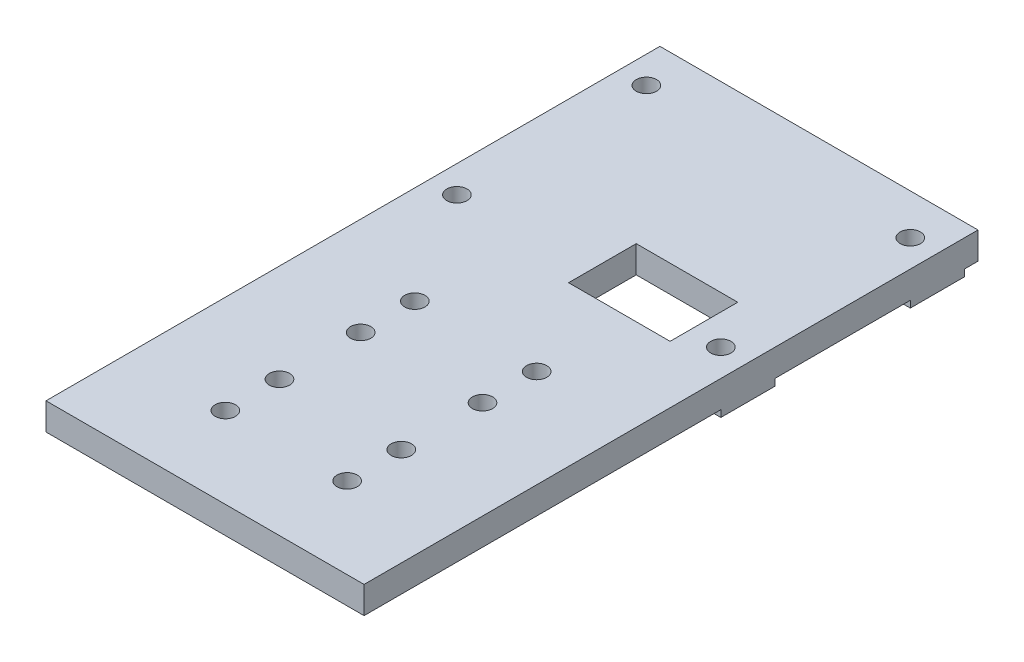
ISO-10303-21;
HEADER;
FILE_DESCRIPTION(('STEP AP214'),'2;1');
FILE_NAME('part.step','',(''),(''),'','','');
FILE_SCHEMA(('AUTOMOTIVE_DESIGN { 1 0 10303 214 1 1 1 1 }'));
ENDSEC;
DATA;
#1=APPLICATION_CONTEXT('core data for automotive mechanical design processes');
#2=APPLICATION_PROTOCOL_DEFINITION('international standard','automotive_design',2000,#1);
#3=PRODUCT_CONTEXT('',#1,'mechanical');
#4=PRODUCT('Part','Part','',(#3));
#5=PRODUCT_RELATED_PRODUCT_CATEGORY('part','',(#4));
#6=PRODUCT_DEFINITION_FORMATION('','',#4);
#7=PRODUCT_DEFINITION_CONTEXT('part definition',#1,'design');
#8=PRODUCT_DEFINITION('design','',#6,#7);
#9=PRODUCT_DEFINITION_SHAPE('','',#8);
#10=(LENGTH_UNIT() NAMED_UNIT(*) SI_UNIT(.MILLI.,.METRE.));
#11=(NAMED_UNIT(*) PLANE_ANGLE_UNIT() SI_UNIT($,.RADIAN.));
#12=(NAMED_UNIT(*) SI_UNIT($,.STERADIAN.) SOLID_ANGLE_UNIT());
#13=UNCERTAINTY_MEASURE_WITH_UNIT(LENGTH_MEASURE(1.E-05),#10,'distance_accuracy_value','');
#14=(GEOMETRIC_REPRESENTATION_CONTEXT(3) GLOBAL_UNCERTAINTY_ASSIGNED_CONTEXT((#13)) GLOBAL_UNIT_ASSIGNED_CONTEXT((#10,
#11,#12)) REPRESENTATION_CONTEXT('',''));
#15=CARTESIAN_POINT('',(0.,0.,0.));
#16=DIRECTION('',(0.,0.,1.));
#17=DIRECTION('',(1.,0.,0.));
#18=AXIS2_PLACEMENT_3D('',#15,#16,#17);
#19=CARTESIAN_POINT('',(0.,0.,0.));
#20=DIRECTION('',(0.,1.,0.));
#21=DIRECTION('',(0.,0.,1.));
#22=AXIS2_PLACEMENT_3D('',#19,#20,#21);
#23=PLANE('',#22);
#24=CARTESIAN_POINT('',(-9.,0.,30.72));
#25=DIRECTION('',(0.,1.,0.));
#26=DIRECTION('',(0.,0.,-1.));
#27=AXIS2_PLACEMENT_3D('',#24,#25,#26);
#28=CIRCLE('',#27,1.5);
#29=CARTESIAN_POINT('',(-9.,0.,29.22));
#30=VERTEX_POINT('',#29);
#31=EDGE_CURVE('E214',#30,#30,#28,.T.);
#32=ORIENTED_EDGE('',*,*,#31,.T.);
#33=EDGE_LOOP('',(#32));
#34=FACE_BOUND('',#33,.T.);
#35=CARTESIAN_POINT('',(-9.,0.,50.72));
#36=DIRECTION('',(0.,1.,0.));
#37=DIRECTION('',(0.,0.,-1.));
#38=AXIS2_PLACEMENT_3D('',#35,#36,#37);
#39=CIRCLE('',#38,1.5);
#40=CARTESIAN_POINT('',(-9.,0.,49.22));
#41=VERTEX_POINT('',#40);
#42=EDGE_CURVE('E502',#41,#41,#39,.T.);
#43=ORIENTED_EDGE('',*,*,#42,.T.);
#44=EDGE_LOOP('',(#43));
#45=FACE_BOUND('',#44,.T.);
#46=CARTESIAN_POINT('',(9.00000000000001,0.,50.72));
#47=DIRECTION('',(0.,1.,0.));
#48=DIRECTION('',(0.,0.,1.));
#49=AXIS2_PLACEMENT_3D('',#46,#47,#48);
#50=CIRCLE('',#49,1.5);
#51=CARTESIAN_POINT('',(9.00000000000001,0.,52.22));
#52=VERTEX_POINT('',#51);
#53=EDGE_CURVE('E494',#52,#52,#50,.T.);
#54=ORIENTED_EDGE('',*,*,#53,.T.);
#55=EDGE_LOOP('',(#54));
#56=FACE_BOUND('',#55,.T.);
#57=CARTESIAN_POINT('',(9.00000000000001,0.,38.72));
#58=DIRECTION('',(0.,1.,0.));
#59=DIRECTION('',(0.,0.,1.));
#60=AXIS2_PLACEMENT_3D('',#57,#58,#59);
#61=CIRCLE('',#60,1.5);
#62=CARTESIAN_POINT('',(9.00000000000001,0.,40.22));
#63=VERTEX_POINT('',#62);
#64=EDGE_CURVE('E1096',#63,#63,#61,.T.);
#65=ORIENTED_EDGE('',*,*,#64,.T.);
#66=EDGE_LOOP('',(#65));
#67=FACE_BOUND('',#66,.T.);
#68=CARTESIAN_POINT('',(9.00000000000002,0.,58.72));
#69=DIRECTION('',(0.,1.,0.));
#70=DIRECTION('',(0.,0.,1.));
#71=AXIS2_PLACEMENT_3D('',#68,#69,#70);
#72=CIRCLE('',#71,1.5);
#73=CARTESIAN_POINT('',(9.00000000000002,0.,60.22));
#74=VERTEX_POINT('',#73);
#75=EDGE_CURVE('E1088',#74,#74,#72,.T.);
#76=ORIENTED_EDGE('',*,*,#75,.T.);
#77=EDGE_LOOP('',(#76));
#78=FACE_BOUND('',#77,.T.);
#79=CARTESIAN_POINT('',(-9.,0.,58.72));
#80=DIRECTION('',(0.,1.,0.));
#81=DIRECTION('',(0.,0.,-1.));
#82=AXIS2_PLACEMENT_3D('',#79,#80,#81);
#83=CIRCLE('',#82,1.5);
#84=CARTESIAN_POINT('',(-9.,0.,57.22));
#85=VERTEX_POINT('',#84);
#86=EDGE_CURVE('E1080',#85,#85,#83,.T.);
#87=ORIENTED_EDGE('',*,*,#86,.T.);
#88=EDGE_LOOP('',(#87));
#89=FACE_BOUND('',#88,.T.);
#90=CARTESIAN_POINT('',(-9.,0.,38.72));
#91=DIRECTION('',(0.,1.,0.));
#92=DIRECTION('',(0.,0.,-1.));
#93=AXIS2_PLACEMENT_3D('',#90,#91,#92);
#94=CIRCLE('',#93,1.5);
#95=CARTESIAN_POINT('',(-9.,0.,37.22));
#96=VERTEX_POINT('',#95);
#97=EDGE_CURVE('E1072',#96,#96,#94,.T.);
#98=ORIENTED_EDGE('',*,*,#97,.T.);
#99=EDGE_LOOP('',(#98));
#100=FACE_BOUND('',#99,.T.);
#101=CARTESIAN_POINT('',(9.00000000000001,0.,30.72));
#102=DIRECTION('',(0.,1.,0.));
#103=DIRECTION('',(0.,0.,1.));
#104=AXIS2_PLACEMENT_3D('',#101,#102,#103);
#105=CIRCLE('',#104,1.5);
#106=CARTESIAN_POINT('',(9.00000000000001,0.,32.22));
#107=VERTEX_POINT('',#106);
#108=EDGE_CURVE('E507',#107,#107,#105,.T.);
#109=ORIENTED_EDGE('',*,*,#108,.T.);
#110=EDGE_LOOP('',(#109));
#111=FACE_BOUND('',#110,.T.);
#112=DIRECTION('',(0.,0.,1.));
#113=VECTOR('',#112,1.);
#114=CARTESIAN_POINT('',(0.,0.,0.));
#115=LINE('',#114,#113);
#116=CARTESIAN_POINT('',(0.,0.,7.));
#117=VERTEX_POINT('',#116);
#118=CARTESIAN_POINT('',(0.,0.,17.));
#119=VERTEX_POINT('',#118);
#120=EDGE_CURVE('E256',#117,#119,#115,.T.);
#121=ORIENTED_EDGE('',*,*,#120,.T.);
#122=DIRECTION('',(-1.,0.,0.));
#123=VECTOR('',#122,1.);
#124=CARTESIAN_POINT('',(0.,0.,17.));
#125=LINE('',#124,#123);
#126=CARTESIAN_POINT('',(15.,0.,17.));
#127=VERTEX_POINT('',#126);
#128=EDGE_CURVE('E267',#127,#119,#125,.T.);
#129=ORIENTED_EDGE('',*,*,#128,.F.);
#130=DIRECTION('',(0.,0.,1.));
#131=VECTOR('',#130,1.);
#132=CARTESIAN_POINT('',(15.,0.,0.));
#133=LINE('',#132,#131);
#134=CARTESIAN_POINT('',(15.,0.,6.99999999999999));
#135=VERTEX_POINT('',#134);
#136=EDGE_CURVE('E264',#135,#127,#133,.T.);
#137=ORIENTED_EDGE('',*,*,#136,.F.);
#138=DIRECTION('',(1.,0.,0.));
#139=VECTOR('',#138,1.);
#140=CARTESIAN_POINT('',(0.,0.,7.));
#141=LINE('',#140,#139);
#142=EDGE_CURVE('E260',#117,#135,#141,.T.);
#143=ORIENTED_EDGE('',*,*,#142,.F.);
#144=EDGE_LOOP('',(#121,#129,#137,#143));
#145=FACE_BOUND('',#144,.T.);
#146=DIRECTION('',(0.,0.,-1.));
#147=VECTOR('',#146,1.);
#148=CARTESIAN_POINT('',(23.5,0.,0.));
#149=LINE('',#148,#147);
#150=CARTESIAN_POINT('',(23.5,0.,70.72));
#151=VERTEX_POINT('',#150);
#152=CARTESIAN_POINT('',(23.5,0.,18.));
#153=VERTEX_POINT('',#152);
#154=EDGE_CURVE('E276',#151,#153,#149,.T.);
#155=ORIENTED_EDGE('',*,*,#154,.F.);
#156=DIRECTION('',(-1.,0.,0.));
#157=VECTOR('',#156,1.);
#158=CARTESIAN_POINT('',(-23.5,0.,70.72));
#159=LINE('',#158,#157);
#160=CARTESIAN_POINT('',(-23.5,0.,70.72));
#161=VERTEX_POINT('',#160);
#162=EDGE_CURVE('E215',#151,#161,#159,.T.);
#163=ORIENTED_EDGE('',*,*,#162,.T.);
#164=DIRECTION('',(0.,0.,-1.));
#165=VECTOR('',#164,1.);
#166=CARTESIAN_POINT('',(-23.5,0.,0.));
#167=LINE('',#166,#165);
#168=CARTESIAN_POINT('',(-23.5,0.,18.));
#169=VERTEX_POINT('',#168);
#170=EDGE_CURVE('E224',#161,#169,#167,.T.);
#171=ORIENTED_EDGE('',*,*,#170,.T.);
#172=DIRECTION('',(-1.,0.,0.));
#173=VECTOR('',#172,1.);
#174=CARTESIAN_POINT('',(-15.5,0.,18.));
#175=LINE('',#174,#173);
#176=CARTESIAN_POINT('',(-15.5,0.,18.));
#177=VERTEX_POINT('',#176);
#178=EDGE_CURVE('E70',#177,#169,#175,.T.);
#179=ORIENTED_EDGE('',*,*,#178,.F.);
#180=DIRECTION('',(0.,0.,1.));
#181=VECTOR('',#180,1.);
#182=CARTESIAN_POINT('',(-15.5,0.,10.));
#183=LINE('',#182,#181);
#184=CARTESIAN_POINT('',(-15.5,0.,10.));
#185=VERTEX_POINT('',#184);
#186=EDGE_CURVE('E536',#185,#177,#183,.T.);
#187=ORIENTED_EDGE('',*,*,#186,.F.);
#188=DIRECTION('',(1.,0.,0.));
#189=VECTOR('',#188,1.);
#190=CARTESIAN_POINT('',(-15.5,0.,10.));
#191=LINE('',#190,#189);
#192=CARTESIAN_POINT('',(-23.5,0.,10.));
#193=VERTEX_POINT('',#192);
#194=EDGE_CURVE('E529',#193,#185,#191,.T.);
#195=ORIENTED_EDGE('',*,*,#194,.F.);
#196=CARTESIAN_POINT('',(-23.5,0.,-10.));
#197=VERTEX_POINT('',#196);
#198=EDGE_CURVE('E275',#193,#197,#167,.T.);
#199=ORIENTED_EDGE('',*,*,#198,.T.);
#200=DIRECTION('',(-1.,0.,0.));
#201=VECTOR('',#200,1.);
#202=CARTESIAN_POINT('',(-15.5,0.,-10.));
#203=LINE('',#202,#201);
#204=CARTESIAN_POINT('',(-15.5,0.,-10.));
#205=VERTEX_POINT('',#204);
#206=EDGE_CURVE('E459',#205,#197,#203,.T.);
#207=ORIENTED_EDGE('',*,*,#206,.F.);
#208=DIRECTION('',(0.,0.,1.));
#209=VECTOR('',#208,1.);
#210=CARTESIAN_POINT('',(-15.5,0.,-10.));
#211=LINE('',#210,#209);
#212=CARTESIAN_POINT('',(-15.5,0.,-18.));
#213=VERTEX_POINT('',#212);
#214=EDGE_CURVE('E571',#213,#205,#211,.T.);
#215=ORIENTED_EDGE('',*,*,#214,.F.);
#216=DIRECTION('',(1.,0.,0.));
#217=VECTOR('',#216,1.);
#218=CARTESIAN_POINT('',(-15.5,0.,-18.));
#219=LINE('',#218,#217);
#220=CARTESIAN_POINT('',(-23.5,0.,-18.));
#221=VERTEX_POINT('',#220);
#222=EDGE_CURVE('E401',#221,#213,#219,.T.);
#223=ORIENTED_EDGE('',*,*,#222,.F.);
#224=CARTESIAN_POINT('',(-23.5,0.,-20.));
#225=VERTEX_POINT('',#224);
#226=EDGE_CURVE('E271',#221,#225,#167,.T.);
#227=ORIENTED_EDGE('',*,*,#226,.T.);
#228=DIRECTION('',(1.,0.,0.));
#229=VECTOR('',#228,1.);
#230=CARTESIAN_POINT('',(0.,0.,-20.));
#231=LINE('',#230,#229);
#232=CARTESIAN_POINT('',(23.5,0.,-20.));
#233=VERTEX_POINT('',#232);
#234=EDGE_CURVE('E279',#225,#233,#231,.T.);
#235=ORIENTED_EDGE('',*,*,#234,.T.);
#236=CARTESIAN_POINT('',(23.5,0.,-18.));
#237=VERTEX_POINT('',#236);
#238=EDGE_CURVE('E274',#237,#233,#149,.T.);
#239=ORIENTED_EDGE('',*,*,#238,.F.);
#240=DIRECTION('',(1.,0.,0.));
#241=VECTOR('',#240,1.);
#242=CARTESIAN_POINT('',(15.5,0.,-18.));
#243=LINE('',#242,#241);
#244=CARTESIAN_POINT('',(15.5,0.,-18.));
#245=VERTEX_POINT('',#244);
#246=EDGE_CURVE('E415',#245,#237,#243,.T.);
#247=ORIENTED_EDGE('',*,*,#246,.F.);
#248=DIRECTION('',(0.,0.,-1.));
#249=VECTOR('',#248,1.);
#250=CARTESIAN_POINT('',(15.5,0.,-10.));
#251=LINE('',#250,#249);
#252=CARTESIAN_POINT('',(15.5,0.,-10.));
#253=VERTEX_POINT('',#252);
#254=EDGE_CURVE('E352',#253,#245,#251,.T.);
#255=ORIENTED_EDGE('',*,*,#254,.F.);
#256=DIRECTION('',(-1.,0.,0.));
#257=VECTOR('',#256,1.);
#258=CARTESIAN_POINT('',(15.5,0.,-10.));
#259=LINE('',#258,#257);
#260=CARTESIAN_POINT('',(23.5,0.,-10.));
#261=VERTEX_POINT('',#260);
#262=EDGE_CURVE('E420',#261,#253,#259,.T.);
#263=ORIENTED_EDGE('',*,*,#262,.F.);
#264=CARTESIAN_POINT('',(23.5,0.,10.));
#265=VERTEX_POINT('',#264);
#266=EDGE_CURVE('E280',#265,#261,#149,.T.);
#267=ORIENTED_EDGE('',*,*,#266,.F.);
#268=DIRECTION('',(1.,0.,0.));
#269=VECTOR('',#268,1.);
#270=CARTESIAN_POINT('',(15.5,0.,10.));
#271=LINE('',#270,#269);
#272=CARTESIAN_POINT('',(15.5,0.,10.));
#273=VERTEX_POINT('',#272);
#274=EDGE_CURVE('E361',#273,#265,#271,.T.);
#275=ORIENTED_EDGE('',*,*,#274,.F.);
#276=DIRECTION('',(0.,0.,-1.));
#277=VECTOR('',#276,1.);
#278=CARTESIAN_POINT('',(15.5,0.,10.));
#279=LINE('',#278,#277);
#280=CARTESIAN_POINT('',(15.5,0.,18.));
#281=VERTEX_POINT('',#280);
#282=EDGE_CURVE('E349',#281,#273,#279,.T.);
#283=ORIENTED_EDGE('',*,*,#282,.F.);
#284=DIRECTION('',(-1.,0.,0.));
#285=VECTOR('',#284,1.);
#286=CARTESIAN_POINT('',(15.5,0.,18.));
#287=LINE('',#286,#285);
#288=EDGE_CURVE('E343',#153,#281,#287,.T.);
#289=ORIENTED_EDGE('',*,*,#288,.F.);
#290=EDGE_LOOP('',(#155,#163,#171,#179,#187,#195,#199,#207,#215,#223,#227,#235,#239,#247,#255,
#263,#267,#275,#283,#289));
#291=FACE_BOUND('',#290,.T.);
#292=ADVANCED_FACE('F44',(#34,#45,#56,#67,#78,#89,#100,#111,#145,#291),#23,.F.);
#293=CARTESIAN_POINT('',(-23.5,4.,0.));
#294=DIRECTION('',(-1.,0.,0.));
#295=DIRECTION('',(0.,0.,1.));
#296=AXIS2_PLACEMENT_3D('',#293,#294,#295);
#297=PLANE('',#296);
#298=DIRECTION('',(0.,1.,0.));
#299=VECTOR('',#298,1.);
#300=CARTESIAN_POINT('',(-23.5,0.,70.72));
#301=LINE('',#300,#299);
#302=CARTESIAN_POINT('',(-23.5,4.,70.72));
#303=VERTEX_POINT('',#302);
#304=EDGE_CURVE('E208',#161,#303,#301,.T.);
#305=ORIENTED_EDGE('',*,*,#304,.T.);
#306=DIRECTION('',(0.,0.,-1.));
#307=VECTOR('',#306,1.);
#308=CARTESIAN_POINT('',(-23.5,4.,0.));
#309=LINE('',#308,#307);
#310=CARTESIAN_POINT('',(-23.5,4.,-20.));
#311=VERTEX_POINT('',#310);
#312=EDGE_CURVE('E221',#303,#311,#309,.T.);
#313=ORIENTED_EDGE('',*,*,#312,.T.);
#314=DIRECTION('',(0.,-1.,0.));
#315=VECTOR('',#314,1.);
#316=CARTESIAN_POINT('',(-23.5,4.,-20.));
#317=LINE('',#316,#315);
#318=EDGE_CURVE('E54',#311,#225,#317,.T.);
#319=ORIENTED_EDGE('',*,*,#318,.T.);
#320=ORIENTED_EDGE('',*,*,#226,.F.);
#321=DIRECTION('',(0.,1.,0.));
#322=VECTOR('',#321,1.);
#323=CARTESIAN_POINT('',(-23.5,-1.,-18.));
#324=LINE('',#323,#322);
#325=CARTESIAN_POINT('',(-23.5,-1.,-18.));
#326=VERTEX_POINT('',#325);
#327=EDGE_CURVE('E559',#326,#221,#324,.T.);
#328=ORIENTED_EDGE('',*,*,#327,.F.);
#329=DIRECTION('',(0.,0.,-1.));
#330=VECTOR('',#329,1.);
#331=CARTESIAN_POINT('',(-23.5,-1.,-10.));
#332=LINE('',#331,#330);
#333=CARTESIAN_POINT('',(-23.5,-1.,-10.));
#334=VERTEX_POINT('',#333);
#335=EDGE_CURVE('E586',#334,#326,#332,.T.);
#336=ORIENTED_EDGE('',*,*,#335,.F.);
#337=DIRECTION('',(0.,1.,0.));
#338=VECTOR('',#337,1.);
#339=CARTESIAN_POINT('',(-23.5,-1.,-10.));
#340=LINE('',#339,#338);
#341=EDGE_CURVE('E555',#334,#197,#340,.T.);
#342=ORIENTED_EDGE('',*,*,#341,.T.);
#343=ORIENTED_EDGE('',*,*,#198,.F.);
#344=DIRECTION('',(0.,1.,0.));
#345=VECTOR('',#344,1.);
#346=CARTESIAN_POINT('',(-23.5,-1.,10.));
#347=LINE('',#346,#345);
#348=CARTESIAN_POINT('',(-23.5,-1.,10.));
#349=VERTEX_POINT('',#348);
#350=EDGE_CURVE('E520',#349,#193,#347,.T.);
#351=ORIENTED_EDGE('',*,*,#350,.F.);
#352=DIRECTION('',(0.,0.,-1.));
#353=VECTOR('',#352,1.);
#354=CARTESIAN_POINT('',(-23.5,-1.,10.));
#355=LINE('',#354,#353);
#356=CARTESIAN_POINT('',(-23.5,-1.,18.));
#357=VERTEX_POINT('',#356);
#358=EDGE_CURVE('E543',#357,#349,#355,.T.);
#359=ORIENTED_EDGE('',*,*,#358,.F.);
#360=DIRECTION('',(0.,1.,0.));
#361=VECTOR('',#360,1.);
#362=CARTESIAN_POINT('',(-23.5,-1.,18.));
#363=LINE('',#362,#361);
#364=EDGE_CURVE('E517',#357,#169,#363,.T.);
#365=ORIENTED_EDGE('',*,*,#364,.T.);
#366=ORIENTED_EDGE('',*,*,#170,.F.);
#367=EDGE_LOOP('',(#305,#313,#319,#320,#328,#336,#342,#343,#351,#359,#365,#366));
#368=FACE_BOUND('',#367,.T.);
#369=ADVANCED_FACE('F219',(#368),#297,.T.);
#370=CARTESIAN_POINT('',(23.5,4.,0.));
#371=DIRECTION('',(-1.,0.,0.));
#372=DIRECTION('',(0.,0.,1.));
#373=AXIS2_PLACEMENT_3D('',#370,#371,#372);
#374=PLANE('',#373);
#375=DIRECTION('',(0.,0.,-1.));
#376=VECTOR('',#375,1.);
#377=CARTESIAN_POINT('',(23.5,4.,0.));
#378=LINE('',#377,#376);
#379=CARTESIAN_POINT('',(23.5,4.,70.72));
#380=VERTEX_POINT('',#379);
#381=CARTESIAN_POINT('',(23.5,4.,-20.));
#382=VERTEX_POINT('',#381);
#383=EDGE_CURVE('E234',#380,#382,#378,.T.);
#384=ORIENTED_EDGE('',*,*,#383,.F.);
#385=DIRECTION('',(0.,1.,0.));
#386=VECTOR('',#385,1.);
#387=CARTESIAN_POINT('',(23.5,0.,70.72));
#388=LINE('',#387,#386);
#389=EDGE_CURVE('E62',#151,#380,#388,.T.);
#390=ORIENTED_EDGE('',*,*,#389,.F.);
#391=ORIENTED_EDGE('',*,*,#154,.T.);
#392=DIRECTION('',(0.,1.,0.));
#393=VECTOR('',#392,1.);
#394=CARTESIAN_POINT('',(23.5,-1.,18.));
#395=LINE('',#394,#393);
#396=CARTESIAN_POINT('',(23.5,-1.,18.));
#397=VERTEX_POINT('',#396);
#398=EDGE_CURVE('E261',#397,#153,#395,.T.);
#399=ORIENTED_EDGE('',*,*,#398,.F.);
#400=DIRECTION('',(0.,0.,1.));
#401=VECTOR('',#400,1.);
#402=CARTESIAN_POINT('',(23.5,-1.,10.));
#403=LINE('',#402,#401);
#404=CARTESIAN_POINT('',(23.5,-1.,10.));
#405=VERTEX_POINT('',#404);
#406=EDGE_CURVE('E356',#405,#397,#403,.T.);
#407=ORIENTED_EDGE('',*,*,#406,.F.);
#408=DIRECTION('',(0.,1.,0.));
#409=VECTOR('',#408,1.);
#410=CARTESIAN_POINT('',(23.5,-1.,10.));
#411=LINE('',#410,#409);
#412=EDGE_CURVE('E369',#405,#265,#411,.T.);
#413=ORIENTED_EDGE('',*,*,#412,.T.);
#414=ORIENTED_EDGE('',*,*,#266,.T.);
#415=DIRECTION('',(0.,1.,0.));
#416=VECTOR('',#415,1.);
#417=CARTESIAN_POINT('',(23.5,-1.,-10.));
#418=LINE('',#417,#416);
#419=CARTESIAN_POINT('',(23.5,-1.,-10.));
#420=VERTEX_POINT('',#419);
#421=EDGE_CURVE('E456',#420,#261,#418,.T.);
#422=ORIENTED_EDGE('',*,*,#421,.F.);
#423=DIRECTION('',(0.,0.,1.));
#424=VECTOR('',#423,1.);
#425=CARTESIAN_POINT('',(23.5,-1.,-10.));
#426=LINE('',#425,#424);
#427=CARTESIAN_POINT('',(23.5,-1.,-18.));
#428=VERTEX_POINT('',#427);
#429=EDGE_CURVE('E432',#428,#420,#426,.T.);
#430=ORIENTED_EDGE('',*,*,#429,.F.);
#431=DIRECTION('',(0.,1.,0.));
#432=VECTOR('',#431,1.);
#433=CARTESIAN_POINT('',(23.5,-1.,-18.));
#434=LINE('',#433,#432);
#435=EDGE_CURVE('E411',#428,#237,#434,.T.);
#436=ORIENTED_EDGE('',*,*,#435,.T.);
#437=ORIENTED_EDGE('',*,*,#238,.T.);
#438=DIRECTION('',(0.,-1.,0.));
#439=VECTOR('',#438,1.);
#440=CARTESIAN_POINT('',(23.5,4.,-20.));
#441=LINE('',#440,#439);
#442=EDGE_CURVE('E11',#382,#233,#441,.T.);
#443=ORIENTED_EDGE('',*,*,#442,.F.);
#444=EDGE_LOOP('',(#384,#390,#391,#399,#407,#413,#414,#422,#430,#436,#437,#443));
#445=FACE_BOUND('',#444,.T.);
#446=ADVANCED_FACE('F408',(#445),#374,.F.);
#447=CARTESIAN_POINT('',(0.,4.,0.));
#448=DIRECTION('',(1.,0.,0.));
#449=DIRECTION('',(0.,0.,-1.));
#450=AXIS2_PLACEMENT_3D('',#447,#448,#449);
#451=PLANE('',#450);
#452=ORIENTED_EDGE('',*,*,#120,.F.);
#453=DIRECTION('',(0.,-1.,0.));
#454=VECTOR('',#453,1.);
#455=CARTESIAN_POINT('',(0.,4.,7.));
#456=LINE('',#455,#454);
#457=CARTESIAN_POINT('',(0.,4.,7.));
#458=VERTEX_POINT('',#457);
#459=EDGE_CURVE('E48',#458,#117,#456,.T.);
#460=ORIENTED_EDGE('',*,*,#459,.F.);
#461=DIRECTION('',(0.,0.,1.));
#462=VECTOR('',#461,1.);
#463=CARTESIAN_POINT('',(0.,4.,0.));
#464=LINE('',#463,#462);
#465=CARTESIAN_POINT('',(0.,4.,17.));
#466=VERTEX_POINT('',#465);
#467=EDGE_CURVE('E284',#458,#466,#464,.T.);
#468=ORIENTED_EDGE('',*,*,#467,.T.);
#469=DIRECTION('',(0.,-1.,0.));
#470=VECTOR('',#469,1.);
#471=CARTESIAN_POINT('',(0.,4.,17.));
#472=LINE('',#471,#470);
#473=EDGE_CURVE('E255',#466,#119,#472,.T.);
#474=ORIENTED_EDGE('',*,*,#473,.T.);
#475=EDGE_LOOP('',(#452,#460,#468,#474));
#476=FACE_BOUND('',#475,.T.);
#477=ADVANCED_FACE('F46',(#476),#451,.T.);
#478=CARTESIAN_POINT('',(0.,4.,7.));
#479=DIRECTION('',(0.,0.,-1.));
#480=DIRECTION('',(-1.,0.,0.));
#481=AXIS2_PLACEMENT_3D('',#478,#479,#480);
#482=PLANE('',#481);
#483=ORIENTED_EDGE('',*,*,#142,.T.);
#484=DIRECTION('',(0.,-1.,0.));
#485=VECTOR('',#484,1.);
#486=CARTESIAN_POINT('',(15.,4.,6.99999999999999));
#487=LINE('',#486,#485);
#488=CARTESIAN_POINT('',(15.,4.,6.99999999999999));
#489=VERTEX_POINT('',#488);
#490=EDGE_CURVE('E292',#489,#135,#487,.T.);
#491=ORIENTED_EDGE('',*,*,#490,.F.);
#492=DIRECTION('',(1.,0.,0.));
#493=VECTOR('',#492,1.);
#494=CARTESIAN_POINT('',(0.,4.,7.));
#495=LINE('',#494,#493);
#496=EDGE_CURVE('E304',#458,#489,#495,.T.);
#497=ORIENTED_EDGE('',*,*,#496,.F.);
#498=ORIENTED_EDGE('',*,*,#459,.T.);
#499=EDGE_LOOP('',(#483,#491,#497,#498));
#500=FACE_BOUND('',#499,.T.);
#501=ADVANCED_FACE('F303',(#500),#482,.F.);
#502=CARTESIAN_POINT('',(15.,4.,0.));
#503=DIRECTION('',(1.,0.,0.));
#504=DIRECTION('',(0.,0.,-1.));
#505=AXIS2_PLACEMENT_3D('',#502,#503,#504);
#506=PLANE('',#505);
#507=ORIENTED_EDGE('',*,*,#136,.T.);
#508=DIRECTION('',(0.,-1.,0.));
#509=VECTOR('',#508,1.);
#510=CARTESIAN_POINT('',(15.,4.,17.));
#511=LINE('',#510,#509);
#512=CARTESIAN_POINT('',(15.,4.,17.));
#513=VERTEX_POINT('',#512);
#514=EDGE_CURVE('E289',#513,#127,#511,.T.);
#515=ORIENTED_EDGE('',*,*,#514,.F.);
#516=DIRECTION('',(0.,0.,1.));
#517=VECTOR('',#516,1.);
#518=CARTESIAN_POINT('',(15.,4.,0.));
#519=LINE('',#518,#517);
#520=EDGE_CURVE('E318',#489,#513,#519,.T.);
#521=ORIENTED_EDGE('',*,*,#520,.F.);
#522=ORIENTED_EDGE('',*,*,#490,.T.);
#523=EDGE_LOOP('',(#507,#515,#521,#522));
#524=FACE_BOUND('',#523,.T.);
#525=ADVANCED_FACE('F317',(#524),#506,.F.);
#526=CARTESIAN_POINT('',(-19.5,4.,14.));
#527=DIRECTION('',(0.,-1.,0.));
#528=DIRECTION('',(0.,0.,-1.));
#529=AXIS2_PLACEMENT_3D('',#526,#527,#528);
#530=CYLINDRICAL_SURFACE('',#529,1.5);
#531=CARTESIAN_POINT('',(-19.5,4.,14.));
#532=DIRECTION('',(0.,1.,0.));
#533=DIRECTION('',(0.,0.,1.));
#534=AXIS2_PLACEMENT_3D('',#531,#532,#533);
#535=CIRCLE('',#534,1.5);
#536=CARTESIAN_POINT('',(-19.5,4.,15.5));
#537=VERTEX_POINT('',#536);
#538=EDGE_CURVE('E247',#537,#537,#535,.T.);
#539=ORIENTED_EDGE('',*,*,#538,.T.);
#540=EDGE_LOOP('',(#539));
#541=FACE_BOUND('',#540,.T.);
#542=CARTESIAN_POINT('',(-19.5,-1.,14.));
#543=DIRECTION('',(0.,-1.,0.));
#544=DIRECTION('',(0.,0.,-1.));
#545=AXIS2_PLACEMENT_3D('',#542,#543,#544);
#546=CIRCLE('',#545,1.5);
#547=CARTESIAN_POINT('',(-19.5,-1.,12.5));
#548=VERTEX_POINT('',#547);
#549=EDGE_CURVE('E540',#548,#548,#546,.T.);
#550=ORIENTED_EDGE('',*,*,#549,.T.);
#551=EDGE_LOOP('',(#550));
#552=FACE_BOUND('',#551,.T.);
#553=ADVANCED_FACE('F647',(#541,#552),#530,.F.);
#554=CARTESIAN_POINT('',(0.,4.,-20.));
#555=DIRECTION('',(0.,0.,-1.));
#556=DIRECTION('',(-1.,0.,0.));
#557=AXIS2_PLACEMENT_3D('',#554,#555,#556);
#558=PLANE('',#557);
#559=ORIENTED_EDGE('',*,*,#234,.F.);
#560=ORIENTED_EDGE('',*,*,#318,.F.);
#561=DIRECTION('',(1.,0.,0.));
#562=VECTOR('',#561,1.);
#563=CARTESIAN_POINT('',(0.,4.,-20.));
#564=LINE('',#563,#562);
#565=EDGE_CURVE('E232',#311,#382,#564,.T.);
#566=ORIENTED_EDGE('',*,*,#565,.T.);
#567=ORIENTED_EDGE('',*,*,#442,.T.);
#568=EDGE_LOOP('',(#559,#560,#566,#567));
#569=FACE_BOUND('',#568,.T.);
#570=ADVANCED_FACE('F405',(#569),#558,.T.);
#571=CARTESIAN_POINT('',(19.5,4.,-14.));
#572=DIRECTION('',(0.,-1.,0.));
#573=DIRECTION('',(0.,0.,-1.));
#574=AXIS2_PLACEMENT_3D('',#571,#572,#573);
#575=CYLINDRICAL_SURFACE('',#574,1.5);
#576=CARTESIAN_POINT('',(19.5,4.,-14.));
#577=DIRECTION('',(0.,1.,0.));
#578=DIRECTION('',(0.,0.,1.));
#579=AXIS2_PLACEMENT_3D('',#576,#577,#578);
#580=CIRCLE('',#579,1.5);
#581=CARTESIAN_POINT('',(19.5,4.,-12.5));
#582=VERTEX_POINT('',#581);
#583=EDGE_CURVE('E235',#582,#582,#580,.T.);
#584=ORIENTED_EDGE('',*,*,#583,.T.);
#585=EDGE_LOOP('',(#584));
#586=FACE_BOUND('',#585,.T.);
#587=CARTESIAN_POINT('',(19.5,-1.,-14.));
#588=DIRECTION('',(0.,-1.,0.));
#589=DIRECTION('',(0.,0.,-1.));
#590=AXIS2_PLACEMENT_3D('',#587,#588,#589);
#591=CIRCLE('',#590,1.5);
#592=CARTESIAN_POINT('',(19.5,-1.,-15.5));
#593=VERTEX_POINT('',#592);
#594=EDGE_CURVE('E344',#593,#593,#591,.T.);
#595=ORIENTED_EDGE('',*,*,#594,.T.);
#596=EDGE_LOOP('',(#595));
#597=FACE_BOUND('',#596,.T.);
#598=ADVANCED_FACE('F336',(#586,#597),#575,.F.);
#599=CARTESIAN_POINT('',(19.5,4.,14.));
#600=DIRECTION('',(0.,-1.,0.));
#601=DIRECTION('',(0.,0.,-1.));
#602=AXIS2_PLACEMENT_3D('',#599,#600,#601);
#603=CYLINDRICAL_SURFACE('',#602,1.5);
#604=CARTESIAN_POINT('',(19.5,4.,14.));
#605=DIRECTION('',(0.,1.,0.));
#606=DIRECTION('',(0.,0.,1.));
#607=AXIS2_PLACEMENT_3D('',#604,#605,#606);
#608=CIRCLE('',#607,1.5);
#609=CARTESIAN_POINT('',(19.5,4.,15.5));
#610=VERTEX_POINT('',#609);
#611=EDGE_CURVE('E241',#610,#610,#608,.F.);
#612=ORIENTED_EDGE('',*,*,#611,.F.);
#613=EDGE_LOOP('',(#612));
#614=FACE_BOUND('',#613,.T.);
#615=CARTESIAN_POINT('',(19.5,-1.,14.));
#616=DIRECTION('',(0.,-1.,0.));
#617=DIRECTION('',(0.,0.,-1.));
#618=AXIS2_PLACEMENT_3D('',#615,#616,#617);
#619=CIRCLE('',#618,1.5);
#620=CARTESIAN_POINT('',(19.5,-1.,12.5));
#621=VERTEX_POINT('',#620);
#622=EDGE_CURVE('E340',#621,#621,#619,.T.);
#623=ORIENTED_EDGE('',*,*,#622,.T.);
#624=EDGE_LOOP('',(#623));
#625=FACE_BOUND('',#624,.T.);
#626=ADVANCED_FACE('F333',(#614,#625),#603,.F.);
#627=CARTESIAN_POINT('',(0.,4.,17.));
#628=DIRECTION('',(0.,0.,1.));
#629=DIRECTION('',(1.,0.,0.));
#630=AXIS2_PLACEMENT_3D('',#627,#628,#629);
#631=PLANE('',#630);
#632=ORIENTED_EDGE('',*,*,#128,.T.);
#633=ORIENTED_EDGE('',*,*,#473,.F.);
#634=DIRECTION('',(-1.,0.,0.));
#635=VECTOR('',#634,1.);
#636=CARTESIAN_POINT('',(0.,4.,17.));
#637=LINE('',#636,#635);
#638=EDGE_CURVE('E316',#513,#466,#637,.T.);
#639=ORIENTED_EDGE('',*,*,#638,.F.);
#640=ORIENTED_EDGE('',*,*,#514,.T.);
#641=EDGE_LOOP('',(#632,#633,#639,#640));
#642=FACE_BOUND('',#641,.T.);
#643=ADVANCED_FACE('F314',(#642),#631,.F.);
#644=CARTESIAN_POINT('',(-19.5,4.,-14.));
#645=DIRECTION('',(0.,-1.,0.));
#646=DIRECTION('',(0.,0.,-1.));
#647=AXIS2_PLACEMENT_3D('',#644,#645,#646);
#648=CYLINDRICAL_SURFACE('',#647,1.5);
#649=CARTESIAN_POINT('',(-19.5,4.,-14.));
#650=DIRECTION('',(0.,1.,0.));
#651=DIRECTION('',(0.,0.,1.));
#652=AXIS2_PLACEMENT_3D('',#649,#650,#651);
#653=CIRCLE('',#652,1.5);
#654=CARTESIAN_POINT('',(-19.5,4.,-12.5));
#655=VERTEX_POINT('',#654);
#656=EDGE_CURVE('E251',#655,#655,#653,.F.);
#657=ORIENTED_EDGE('',*,*,#656,.F.);
#658=EDGE_LOOP('',(#657));
#659=FACE_BOUND('',#658,.T.);
#660=CARTESIAN_POINT('',(-19.5,-1.,-14.));
#661=DIRECTION('',(0.,-1.,0.));
#662=DIRECTION('',(0.,0.,-1.));
#663=AXIS2_PLACEMENT_3D('',#660,#661,#662);
#664=CIRCLE('',#663,1.5);
#665=CARTESIAN_POINT('',(-19.5,-1.,-15.5));
#666=VERTEX_POINT('',#665);
#667=EDGE_CURVE('E452',#666,#666,#664,.T.);
#668=ORIENTED_EDGE('',*,*,#667,.T.);
#669=EDGE_LOOP('',(#668));
#670=FACE_BOUND('',#669,.T.);
#671=ADVANCED_FACE('F643',(#659,#670),#648,.F.);
#672=CARTESIAN_POINT('',(0.,4.,0.));
#673=DIRECTION('',(0.,1.,0.));
#674=DIRECTION('',(0.,0.,1.));
#675=AXIS2_PLACEMENT_3D('',#672,#673,#674);
#676=PLANE('',#675);
#677=DIRECTION('',(-1.,0.,0.));
#678=VECTOR('',#677,1.);
#679=CARTESIAN_POINT('',(-23.5,4.,70.72));
#680=LINE('',#679,#678);
#681=EDGE_CURVE('E205',#380,#303,#680,.T.);
#682=ORIENTED_EDGE('',*,*,#681,.F.);
#683=ORIENTED_EDGE('',*,*,#383,.T.);
#684=ORIENTED_EDGE('',*,*,#565,.F.);
#685=ORIENTED_EDGE('',*,*,#312,.F.);
#686=EDGE_LOOP('',(#682,#683,#684,#685));
#687=FACE_BOUND('',#686,.T.);
#688=CARTESIAN_POINT('',(-9.,4.,30.72));
#689=DIRECTION('',(0.,1.,0.));
#690=DIRECTION('',(0.,0.,-1.));
#691=AXIS2_PLACEMENT_3D('',#688,#689,#690);
#692=CIRCLE('',#691,1.5);
#693=CARTESIAN_POINT('',(-9.,4.,29.22));
#694=VERTEX_POINT('',#693);
#695=EDGE_CURVE('E506',#694,#694,#692,.T.);
#696=ORIENTED_EDGE('',*,*,#695,.F.);
#697=EDGE_LOOP('',(#696));
#698=FACE_BOUND('',#697,.T.);
#699=CARTESIAN_POINT('',(-9.,4.,50.72));
#700=DIRECTION('',(0.,1.,0.));
#701=DIRECTION('',(0.,0.,-1.));
#702=AXIS2_PLACEMENT_3D('',#699,#700,#701);
#703=CIRCLE('',#702,1.5);
#704=CARTESIAN_POINT('',(-9.,4.,49.22));
#705=VERTEX_POINT('',#704);
#706=EDGE_CURVE('E498',#705,#705,#703,.T.);
#707=ORIENTED_EDGE('',*,*,#706,.F.);
#708=EDGE_LOOP('',(#707));
#709=FACE_BOUND('',#708,.T.);
#710=CARTESIAN_POINT('',(9.00000000000001,4.,50.72));
#711=DIRECTION('',(0.,1.,0.));
#712=DIRECTION('',(0.,0.,1.));
#713=AXIS2_PLACEMENT_3D('',#710,#711,#712);
#714=CIRCLE('',#713,1.5);
#715=CARTESIAN_POINT('',(9.00000000000001,4.,52.22));
#716=VERTEX_POINT('',#715);
#717=EDGE_CURVE('E489',#716,#716,#714,.T.);
#718=ORIENTED_EDGE('',*,*,#717,.F.);
#719=EDGE_LOOP('',(#718));
#720=FACE_BOUND('',#719,.T.);
#721=CARTESIAN_POINT('',(9.00000000000001,4.,38.72));
#722=DIRECTION('',(0.,1.,0.));
#723=DIRECTION('',(0.,0.,1.));
#724=AXIS2_PLACEMENT_3D('',#721,#722,#723);
#725=CIRCLE('',#724,1.5);
#726=CARTESIAN_POINT('',(9.00000000000001,4.,40.22));
#727=VERTEX_POINT('',#726);
#728=EDGE_CURVE('E226',#727,#727,#725,.T.);
#729=ORIENTED_EDGE('',*,*,#728,.F.);
#730=EDGE_LOOP('',(#729));
#731=FACE_BOUND('',#730,.T.);
#732=CARTESIAN_POINT('',(9.00000000000002,4.,58.72));
#733=DIRECTION('',(0.,1.,0.));
#734=DIRECTION('',(0.,0.,1.));
#735=AXIS2_PLACEMENT_3D('',#732,#733,#734);
#736=CIRCLE('',#735,1.5);
#737=CARTESIAN_POINT('',(9.00000000000002,4.,60.22));
#738=VERTEX_POINT('',#737);
#739=EDGE_CURVE('E1092',#738,#738,#736,.T.);
#740=ORIENTED_EDGE('',*,*,#739,.F.);
#741=EDGE_LOOP('',(#740));
#742=FACE_BOUND('',#741,.T.);
#743=CARTESIAN_POINT('',(-9.,4.,58.72));
#744=DIRECTION('',(0.,1.,0.));
#745=DIRECTION('',(0.,0.,-1.));
#746=AXIS2_PLACEMENT_3D('',#743,#744,#745);
#747=CIRCLE('',#746,1.5);
#748=CARTESIAN_POINT('',(-9.,4.,57.22));
#749=VERTEX_POINT('',#748);
#750=EDGE_CURVE('E1084',#749,#749,#747,.T.);
#751=ORIENTED_EDGE('',*,*,#750,.F.);
#752=EDGE_LOOP('',(#751));
#753=FACE_BOUND('',#752,.T.);
#754=CARTESIAN_POINT('',(-9.,4.,38.72));
#755=DIRECTION('',(0.,1.,0.));
#756=DIRECTION('',(0.,0.,-1.));
#757=AXIS2_PLACEMENT_3D('',#754,#755,#756);
#758=CIRCLE('',#757,1.5);
#759=CARTESIAN_POINT('',(-9.,4.,37.22));
#760=VERTEX_POINT('',#759);
#761=EDGE_CURVE('E1076',#760,#760,#758,.T.);
#762=ORIENTED_EDGE('',*,*,#761,.F.);
#763=EDGE_LOOP('',(#762));
#764=FACE_BOUND('',#763,.T.);
#765=CARTESIAN_POINT('',(9.00000000000001,4.,30.72));
#766=DIRECTION('',(0.,1.,0.));
#767=DIRECTION('',(0.,0.,1.));
#768=AXIS2_PLACEMENT_3D('',#765,#766,#767);
#769=CIRCLE('',#768,1.5);
#770=CARTESIAN_POINT('',(9.00000000000001,4.,32.22));
#771=VERTEX_POINT('',#770);
#772=EDGE_CURVE('E493',#771,#771,#769,.T.);
#773=ORIENTED_EDGE('',*,*,#772,.F.);
#774=EDGE_LOOP('',(#773));
#775=FACE_BOUND('',#774,.T.);
#776=ORIENTED_EDGE('',*,*,#467,.F.);
#777=ORIENTED_EDGE('',*,*,#496,.T.);
#778=ORIENTED_EDGE('',*,*,#520,.T.);
#779=ORIENTED_EDGE('',*,*,#638,.T.);
#780=EDGE_LOOP('',(#776,#777,#778,#779));
#781=FACE_BOUND('',#780,.T.);
#782=ORIENTED_EDGE('',*,*,#611,.T.);
#783=EDGE_LOOP('',(#782));
#784=FACE_BOUND('',#783,.T.);
#785=ORIENTED_EDGE('',*,*,#583,.F.);
#786=EDGE_LOOP('',(#785));
#787=FACE_BOUND('',#786,.T.);
#788=ORIENTED_EDGE('',*,*,#538,.F.);
#789=EDGE_LOOP('',(#788));
#790=FACE_BOUND('',#789,.T.);
#791=ORIENTED_EDGE('',*,*,#656,.T.);
#792=EDGE_LOOP('',(#791));
#793=FACE_BOUND('',#792,.T.);
#794=ADVANCED_FACE('F229',(#687,#698,#709,#720,#731,#742,#753,#764,#775,#781,#784,#787,#790,
#793),#676,.T.);
#795=CARTESIAN_POINT('',(0.,-1.,0.));
#796=DIRECTION('',(0.,1.,0.));
#797=DIRECTION('',(0.,0.,1.));
#798=AXIS2_PLACEMENT_3D('',#795,#796,#797);
#799=PLANE('',#798);
#800=ORIENTED_EDGE('',*,*,#406,.T.);
#801=DIRECTION('',(-1.,0.,0.));
#802=VECTOR('',#801,1.);
#803=CARTESIAN_POINT('',(15.5,-1.,18.));
#804=LINE('',#803,#802);
#805=CARTESIAN_POINT('',(15.5,-1.,18.));
#806=VERTEX_POINT('',#805);
#807=EDGE_CURVE('E360',#397,#806,#804,.T.);
#808=ORIENTED_EDGE('',*,*,#807,.T.);
#809=DIRECTION('',(0.,0.,-1.));
#810=VECTOR('',#809,1.);
#811=CARTESIAN_POINT('',(15.5,-1.,10.));
#812=LINE('',#811,#810);
#813=CARTESIAN_POINT('',(15.5,-1.,10.));
#814=VERTEX_POINT('',#813);
#815=EDGE_CURVE('E364',#806,#814,#812,.T.);
#816=ORIENTED_EDGE('',*,*,#815,.T.);
#817=DIRECTION('',(1.,0.,0.));
#818=VECTOR('',#817,1.);
#819=CARTESIAN_POINT('',(15.5,-1.,10.));
#820=LINE('',#819,#818);
#821=EDGE_CURVE('E367',#814,#405,#820,.T.);
#822=ORIENTED_EDGE('',*,*,#821,.T.);
#823=EDGE_LOOP('',(#800,#808,#816,#822));
#824=FACE_BOUND('',#823,.T.);
#825=ORIENTED_EDGE('',*,*,#622,.F.);
#826=EDGE_LOOP('',(#825));
#827=FACE_BOUND('',#826,.T.);
#828=ADVANCED_FACE('F814',(#824,#827),#799,.F.);
#829=CARTESIAN_POINT('',(15.5,-1.,18.));
#830=DIRECTION('',(0.,0.,-1.));
#831=DIRECTION('',(-1.,0.,0.));
#832=AXIS2_PLACEMENT_3D('',#829,#830,#831);
#833=PLANE('',#832);
#834=ORIENTED_EDGE('',*,*,#288,.T.);
#835=DIRECTION('',(0.,1.,0.));
#836=VECTOR('',#835,1.);
#837=CARTESIAN_POINT('',(15.5,-1.,18.));
#838=LINE('',#837,#836);
#839=EDGE_CURVE('E384',#806,#281,#838,.T.);
#840=ORIENTED_EDGE('',*,*,#839,.F.);
#841=ORIENTED_EDGE('',*,*,#807,.F.);
#842=ORIENTED_EDGE('',*,*,#398,.T.);
#843=EDGE_LOOP('',(#834,#840,#841,#842));
#844=FACE_BOUND('',#843,.T.);
#845=ADVANCED_FACE('F481',(#844),#833,.F.);
#846=CARTESIAN_POINT('',(15.5,-1.,10.));
#847=DIRECTION('',(1.,0.,0.));
#848=DIRECTION('',(0.,0.,-1.));
#849=AXIS2_PLACEMENT_3D('',#846,#847,#848);
#850=PLANE('',#849);
#851=ORIENTED_EDGE('',*,*,#282,.T.);
#852=DIRECTION('',(0.,1.,0.));
#853=VECTOR('',#852,1.);
#854=CARTESIAN_POINT('',(15.5,-1.,10.));
#855=LINE('',#854,#853);
#856=EDGE_CURVE('E380',#814,#273,#855,.T.);
#857=ORIENTED_EDGE('',*,*,#856,.F.);
#858=ORIENTED_EDGE('',*,*,#815,.F.);
#859=ORIENTED_EDGE('',*,*,#839,.T.);
#860=EDGE_LOOP('',(#851,#857,#858,#859));
#861=FACE_BOUND('',#860,.T.);
#862=ADVANCED_FACE('F477',(#861),#850,.F.);
#863=CARTESIAN_POINT('',(15.5,-1.,10.));
#864=DIRECTION('',(0.,0.,1.));
#865=DIRECTION('',(1.,0.,0.));
#866=AXIS2_PLACEMENT_3D('',#863,#864,#865);
#867=PLANE('',#866);
#868=ORIENTED_EDGE('',*,*,#274,.T.);
#869=ORIENTED_EDGE('',*,*,#412,.F.);
#870=ORIENTED_EDGE('',*,*,#821,.F.);
#871=ORIENTED_EDGE('',*,*,#856,.T.);
#872=EDGE_LOOP('',(#868,#869,#870,#871));
#873=FACE_BOUND('',#872,.T.);
#874=ADVANCED_FACE('F473',(#873),#867,.F.);
#875=CARTESIAN_POINT('',(0.,-1.,0.));
#876=DIRECTION('',(0.,-1.,0.));
#877=DIRECTION('',(0.,0.,-1.));
#878=AXIS2_PLACEMENT_3D('',#875,#876,#877);
#879=PLANE('',#878);
#880=DIRECTION('',(0.,0.,-1.));
#881=VECTOR('',#880,1.);
#882=CARTESIAN_POINT('',(15.5,-1.,-10.));
#883=LINE('',#882,#881);
#884=CARTESIAN_POINT('',(15.5,-1.,-10.));
#885=VERTEX_POINT('',#884);
#886=CARTESIAN_POINT('',(15.5,-1.,-18.));
#887=VERTEX_POINT('',#886);
#888=EDGE_CURVE('E425',#885,#887,#883,.T.);
#889=ORIENTED_EDGE('',*,*,#888,.T.);
#890=DIRECTION('',(1.,0.,0.));
#891=VECTOR('',#890,1.);
#892=CARTESIAN_POINT('',(15.5,-1.,-18.));
#893=LINE('',#892,#891);
#894=EDGE_CURVE('E436',#887,#428,#893,.T.);
#895=ORIENTED_EDGE('',*,*,#894,.T.);
#896=ORIENTED_EDGE('',*,*,#429,.T.);
#897=DIRECTION('',(-1.,0.,0.));
#898=VECTOR('',#897,1.);
#899=CARTESIAN_POINT('',(15.5,-1.,-10.));
#900=LINE('',#899,#898);
#901=EDGE_CURVE('E429',#420,#885,#900,.T.);
#902=ORIENTED_EDGE('',*,*,#901,.T.);
#903=EDGE_LOOP('',(#889,#895,#896,#902));
#904=FACE_BOUND('',#903,.T.);
#905=ORIENTED_EDGE('',*,*,#594,.F.);
#906=EDGE_LOOP('',(#905));
#907=FACE_BOUND('',#906,.T.);
#908=ADVANCED_FACE('F443',(#904,#907),#879,.T.);
#909=CARTESIAN_POINT('',(15.5,-1.,-10.));
#910=DIRECTION('',(1.,0.,0.));
#911=DIRECTION('',(0.,0.,-1.));
#912=AXIS2_PLACEMENT_3D('',#909,#910,#911);
#913=PLANE('',#912);
#914=ORIENTED_EDGE('',*,*,#254,.T.);
#915=DIRECTION('',(0.,1.,0.));
#916=VECTOR('',#915,1.);
#917=CARTESIAN_POINT('',(15.5,-1.,-18.));
#918=LINE('',#917,#916);
#919=EDGE_CURVE('E449',#887,#245,#918,.T.);
#920=ORIENTED_EDGE('',*,*,#919,.F.);
#921=ORIENTED_EDGE('',*,*,#888,.F.);
#922=DIRECTION('',(0.,1.,0.));
#923=VECTOR('',#922,1.);
#924=CARTESIAN_POINT('',(15.5,-1.,-10.));
#925=LINE('',#924,#923);
#926=EDGE_CURVE('E433',#885,#253,#925,.T.);
#927=ORIENTED_EDGE('',*,*,#926,.T.);
#928=EDGE_LOOP('',(#914,#920,#921,#927));
#929=FACE_BOUND('',#928,.T.);
#930=ADVANCED_FACE('F450',(#929),#913,.F.);
#931=CARTESIAN_POINT('',(15.5,-1.,-18.));
#932=DIRECTION('',(0.,0.,1.));
#933=DIRECTION('',(1.,0.,0.));
#934=AXIS2_PLACEMENT_3D('',#931,#932,#933);
#935=PLANE('',#934);
#936=ORIENTED_EDGE('',*,*,#246,.T.);
#937=ORIENTED_EDGE('',*,*,#435,.F.);
#938=ORIENTED_EDGE('',*,*,#894,.F.);
#939=ORIENTED_EDGE('',*,*,#919,.T.);
#940=EDGE_LOOP('',(#936,#937,#938,#939));
#941=FACE_BOUND('',#940,.T.);
#942=ADVANCED_FACE('F759',(#941),#935,.F.);
#943=CARTESIAN_POINT('',(15.5,-1.,-10.));
#944=DIRECTION('',(0.,0.,-1.));
#945=DIRECTION('',(-1.,0.,0.));
#946=AXIS2_PLACEMENT_3D('',#943,#944,#945);
#947=PLANE('',#946);
#948=ORIENTED_EDGE('',*,*,#262,.T.);
#949=ORIENTED_EDGE('',*,*,#926,.F.);
#950=ORIENTED_EDGE('',*,*,#901,.F.);
#951=ORIENTED_EDGE('',*,*,#421,.T.);
#952=EDGE_LOOP('',(#948,#949,#950,#951));
#953=FACE_BOUND('',#952,.T.);
#954=ADVANCED_FACE('F466',(#953),#947,.F.);
#955=CARTESIAN_POINT('',(0.,-1.,0.));
#956=DIRECTION('',(0.,-1.,0.));
#957=DIRECTION('',(0.,0.,-1.));
#958=AXIS2_PLACEMENT_3D('',#955,#956,#957);
#959=PLANE('',#958);
#960=DIRECTION('',(-1.,0.,0.));
#961=VECTOR('',#960,1.);
#962=CARTESIAN_POINT('',(-15.5,-1.,-10.));
#963=LINE('',#962,#961);
#964=CARTESIAN_POINT('',(-15.5,-1.,-10.));
#965=VERTEX_POINT('',#964);
#966=EDGE_CURVE('E575',#965,#334,#963,.T.);
#967=ORIENTED_EDGE('',*,*,#966,.T.);
#968=ORIENTED_EDGE('',*,*,#335,.T.);
#969=DIRECTION('',(1.,0.,0.));
#970=VECTOR('',#969,1.);
#971=CARTESIAN_POINT('',(-15.5,-1.,-18.));
#972=LINE('',#971,#970);
#973=CARTESIAN_POINT('',(-15.5,-1.,-18.));
#974=VERTEX_POINT('',#973);
#975=EDGE_CURVE('E583',#326,#974,#972,.T.);
#976=ORIENTED_EDGE('',*,*,#975,.T.);
#977=DIRECTION('',(0.,0.,1.));
#978=VECTOR('',#977,1.);
#979=CARTESIAN_POINT('',(-15.5,-1.,-10.));
#980=LINE('',#979,#978);
#981=EDGE_CURVE('E570',#974,#965,#980,.T.);
#982=ORIENTED_EDGE('',*,*,#981,.T.);
#983=EDGE_LOOP('',(#967,#968,#976,#982));
#984=FACE_BOUND('',#983,.T.);
#985=ORIENTED_EDGE('',*,*,#667,.F.);
#986=EDGE_LOOP('',(#985));
#987=FACE_BOUND('',#986,.T.);
#988=ADVANCED_FACE('F593',(#984,#987),#959,.T.);
#989=CARTESIAN_POINT('',(-15.5,-1.,-10.));
#990=DIRECTION('',(0.,0.,-1.));
#991=DIRECTION('',(-1.,0.,0.));
#992=AXIS2_PLACEMENT_3D('',#989,#990,#991);
#993=PLANE('',#992);
#994=ORIENTED_EDGE('',*,*,#206,.T.);
#995=ORIENTED_EDGE('',*,*,#341,.F.);
#996=ORIENTED_EDGE('',*,*,#966,.F.);
#997=DIRECTION('',(0.,1.,0.));
#998=VECTOR('',#997,1.);
#999=CARTESIAN_POINT('',(-15.5,-1.,-10.));
#1000=LINE('',#999,#998);
#1001=EDGE_CURVE('E566',#965,#205,#1000,.T.);
#1002=ORIENTED_EDGE('',*,*,#1001,.T.);
#1003=EDGE_LOOP('',(#994,#995,#996,#1002));
#1004=FACE_BOUND('',#1003,.T.);
#1005=ADVANCED_FACE('F598',(#1004),#993,.F.);
#1006=CARTESIAN_POINT('',(-15.5,-1.,-18.));
#1007=DIRECTION('',(0.,0.,1.));
#1008=DIRECTION('',(1.,0.,0.));
#1009=AXIS2_PLACEMENT_3D('',#1006,#1007,#1008);
#1010=PLANE('',#1009);
#1011=ORIENTED_EDGE('',*,*,#222,.T.);
#1012=DIRECTION('',(0.,1.,0.));
#1013=VECTOR('',#1012,1.);
#1014=CARTESIAN_POINT('',(-15.5,-1.,-18.));
#1015=LINE('',#1014,#1013);
#1016=EDGE_CURVE('E562',#974,#213,#1015,.T.);
#1017=ORIENTED_EDGE('',*,*,#1016,.F.);
#1018=ORIENTED_EDGE('',*,*,#975,.F.);
#1019=ORIENTED_EDGE('',*,*,#327,.T.);
#1020=EDGE_LOOP('',(#1011,#1017,#1018,#1019));
#1021=FACE_BOUND('',#1020,.T.);
#1022=ADVANCED_FACE('F604',(#1021),#1010,.F.);
#1023=CARTESIAN_POINT('',(-15.5,-1.,-10.));
#1024=DIRECTION('',(-1.,0.,0.));
#1025=DIRECTION('',(0.,0.,1.));
#1026=AXIS2_PLACEMENT_3D('',#1023,#1024,#1025);
#1027=PLANE('',#1026);
#1028=ORIENTED_EDGE('',*,*,#214,.T.);
#1029=ORIENTED_EDGE('',*,*,#1001,.F.);
#1030=ORIENTED_EDGE('',*,*,#981,.F.);
#1031=ORIENTED_EDGE('',*,*,#1016,.T.);
#1032=EDGE_LOOP('',(#1028,#1029,#1030,#1031));
#1033=FACE_BOUND('',#1032,.T.);
#1034=ADVANCED_FACE('F606',(#1033),#1027,.F.);
#1035=CARTESIAN_POINT('',(0.,-1.,0.));
#1036=DIRECTION('',(0.,-1.,0.));
#1037=DIRECTION('',(0.,0.,-1.));
#1038=AXIS2_PLACEMENT_3D('',#1035,#1036,#1037);
#1039=PLANE('',#1038);
#1040=DIRECTION('',(0.,0.,1.));
#1041=VECTOR('',#1040,1.);
#1042=CARTESIAN_POINT('',(-15.5,-1.,10.));
#1043=LINE('',#1042,#1041);
#1044=CARTESIAN_POINT('',(-15.5,-1.,10.));
#1045=VERTEX_POINT('',#1044);
#1046=CARTESIAN_POINT('',(-15.5,-1.,18.));
#1047=VERTEX_POINT('',#1046);
#1048=EDGE_CURVE('E533',#1045,#1047,#1043,.T.);
#1049=ORIENTED_EDGE('',*,*,#1048,.T.);
#1050=DIRECTION('',(-1.,0.,0.));
#1051=VECTOR('',#1050,1.);
#1052=CARTESIAN_POINT('',(-15.5,-1.,18.));
#1053=LINE('',#1052,#1051);
#1054=EDGE_CURVE('E546',#1047,#357,#1053,.T.);
#1055=ORIENTED_EDGE('',*,*,#1054,.T.);
#1056=ORIENTED_EDGE('',*,*,#358,.T.);
#1057=DIRECTION('',(1.,0.,0.));
#1058=VECTOR('',#1057,1.);
#1059=CARTESIAN_POINT('',(-15.5,-1.,10.));
#1060=LINE('',#1059,#1058);
#1061=EDGE_CURVE('E528',#349,#1045,#1060,.T.);
#1062=ORIENTED_EDGE('',*,*,#1061,.T.);
#1063=EDGE_LOOP('',(#1049,#1055,#1056,#1062));
#1064=FACE_BOUND('',#1063,.T.);
#1065=ORIENTED_EDGE('',*,*,#549,.F.);
#1066=EDGE_LOOP('',(#1065));
#1067=FACE_BOUND('',#1066,.T.);
#1068=ADVANCED_FACE('F614',(#1064,#1067),#1039,.T.);
#1069=CARTESIAN_POINT('',(-15.5,-1.,10.));
#1070=DIRECTION('',(-1.,0.,0.));
#1071=DIRECTION('',(0.,0.,1.));
#1072=AXIS2_PLACEMENT_3D('',#1069,#1070,#1071);
#1073=PLANE('',#1072);
#1074=ORIENTED_EDGE('',*,*,#186,.T.);
#1075=DIRECTION('',(0.,1.,0.));
#1076=VECTOR('',#1075,1.);
#1077=CARTESIAN_POINT('',(-15.5,-1.,18.));
#1078=LINE('',#1077,#1076);
#1079=EDGE_CURVE('E511',#1047,#177,#1078,.T.);
#1080=ORIENTED_EDGE('',*,*,#1079,.F.);
#1081=ORIENTED_EDGE('',*,*,#1048,.F.);
#1082=DIRECTION('',(0.,1.,0.));
#1083=VECTOR('',#1082,1.);
#1084=CARTESIAN_POINT('',(-15.5,-1.,10.));
#1085=LINE('',#1084,#1083);
#1086=EDGE_CURVE('E524',#1045,#185,#1085,.T.);
#1087=ORIENTED_EDGE('',*,*,#1086,.T.);
#1088=EDGE_LOOP('',(#1074,#1080,#1081,#1087));
#1089=FACE_BOUND('',#1088,.T.);
#1090=ADVANCED_FACE('F621',(#1089),#1073,.F.);
#1091=CARTESIAN_POINT('',(-15.5,-1.,18.));
#1092=DIRECTION('',(0.,0.,-1.));
#1093=DIRECTION('',(-1.,0.,0.));
#1094=AXIS2_PLACEMENT_3D('',#1091,#1092,#1093);
#1095=PLANE('',#1094);
#1096=ORIENTED_EDGE('',*,*,#178,.T.);
#1097=ORIENTED_EDGE('',*,*,#364,.F.);
#1098=ORIENTED_EDGE('',*,*,#1054,.F.);
#1099=ORIENTED_EDGE('',*,*,#1079,.T.);
#1100=EDGE_LOOP('',(#1096,#1097,#1098,#1099));
#1101=FACE_BOUND('',#1100,.T.);
#1102=ADVANCED_FACE('F619',(#1101),#1095,.F.);
#1103=CARTESIAN_POINT('',(-15.5,-1.,10.));
#1104=DIRECTION('',(0.,0.,1.));
#1105=DIRECTION('',(1.,0.,0.));
#1106=AXIS2_PLACEMENT_3D('',#1103,#1104,#1105);
#1107=PLANE('',#1106);
#1108=ORIENTED_EDGE('',*,*,#194,.T.);
#1109=ORIENTED_EDGE('',*,*,#1086,.F.);
#1110=ORIENTED_EDGE('',*,*,#1061,.F.);
#1111=ORIENTED_EDGE('',*,*,#350,.T.);
#1112=EDGE_LOOP('',(#1108,#1109,#1110,#1111));
#1113=FACE_BOUND('',#1112,.T.);
#1114=ADVANCED_FACE('F610',(#1113),#1107,.F.);
#1115=CARTESIAN_POINT('',(9.00000000000001,0.,30.72));
#1116=DIRECTION('',(0.,1.,0.));
#1117=DIRECTION('',(0.,0.,1.));
#1118=AXIS2_PLACEMENT_3D('',#1115,#1116,#1117);
#1119=CYLINDRICAL_SURFACE('',#1118,1.5);
#1120=ORIENTED_EDGE('',*,*,#108,.F.);
#1121=EDGE_LOOP('',(#1120));
#1122=FACE_BOUND('',#1121,.T.);
#1123=ORIENTED_EDGE('',*,*,#772,.T.);
#1124=EDGE_LOOP('',(#1123));
#1125=FACE_BOUND('',#1124,.T.);
#1126=ADVANCED_FACE('F692',(#1122,#1125),#1119,.F.);
#1127=CARTESIAN_POINT('',(-9.,0.,38.72));
#1128=DIRECTION('',(0.,1.,0.));
#1129=DIRECTION('',(0.,0.,1.));
#1130=AXIS2_PLACEMENT_3D('',#1127,#1128,#1129);
#1131=CYLINDRICAL_SURFACE('',#1130,1.5);
#1132=ORIENTED_EDGE('',*,*,#97,.F.);
#1133=EDGE_LOOP('',(#1132));
#1134=FACE_BOUND('',#1133,.T.);
#1135=ORIENTED_EDGE('',*,*,#761,.T.);
#1136=EDGE_LOOP('',(#1135));
#1137=FACE_BOUND('',#1136,.T.);
#1138=ADVANCED_FACE('F960',(#1134,#1137),#1131,.F.);
#1139=CARTESIAN_POINT('',(-9.,0.,58.72));
#1140=DIRECTION('',(0.,1.,0.));
#1141=DIRECTION('',(0.,0.,1.));
#1142=AXIS2_PLACEMENT_3D('',#1139,#1140,#1141);
#1143=CYLINDRICAL_SURFACE('',#1142,1.5);
#1144=ORIENTED_EDGE('',*,*,#86,.F.);
#1145=EDGE_LOOP('',(#1144));
#1146=FACE_BOUND('',#1145,.T.);
#1147=ORIENTED_EDGE('',*,*,#750,.T.);
#1148=EDGE_LOOP('',(#1147));
#1149=FACE_BOUND('',#1148,.T.);
#1150=ADVANCED_FACE('F969',(#1146,#1149),#1143,.F.);
#1151=CARTESIAN_POINT('',(9.00000000000002,0.,58.72));
#1152=DIRECTION('',(0.,1.,0.));
#1153=DIRECTION('',(0.,0.,1.));
#1154=AXIS2_PLACEMENT_3D('',#1151,#1152,#1153);
#1155=CYLINDRICAL_SURFACE('',#1154,1.5);
#1156=ORIENTED_EDGE('',*,*,#75,.F.);
#1157=EDGE_LOOP('',(#1156));
#1158=FACE_BOUND('',#1157,.T.);
#1159=ORIENTED_EDGE('',*,*,#739,.T.);
#1160=EDGE_LOOP('',(#1159));
#1161=FACE_BOUND('',#1160,.T.);
#1162=ADVANCED_FACE('F979',(#1158,#1161),#1155,.F.);
#1163=CARTESIAN_POINT('',(9.00000000000001,0.,38.72));
#1164=DIRECTION('',(0.,1.,0.));
#1165=DIRECTION('',(0.,0.,1.));
#1166=AXIS2_PLACEMENT_3D('',#1163,#1164,#1165);
#1167=CYLINDRICAL_SURFACE('',#1166,1.5);
#1168=ORIENTED_EDGE('',*,*,#64,.F.);
#1169=EDGE_LOOP('',(#1168));
#1170=FACE_BOUND('',#1169,.T.);
#1171=ORIENTED_EDGE('',*,*,#728,.T.);
#1172=EDGE_LOOP('',(#1171));
#1173=FACE_BOUND('',#1172,.T.);
#1174=ADVANCED_FACE('F989',(#1170,#1173),#1167,.F.);
#1175=CARTESIAN_POINT('',(9.00000000000001,0.,50.72));
#1176=DIRECTION('',(0.,1.,0.));
#1177=DIRECTION('',(0.,0.,1.));
#1178=AXIS2_PLACEMENT_3D('',#1175,#1176,#1177);
#1179=CYLINDRICAL_SURFACE('',#1178,1.5);
#1180=ORIENTED_EDGE('',*,*,#53,.F.);
#1181=EDGE_LOOP('',(#1180));
#1182=FACE_BOUND('',#1181,.T.);
#1183=ORIENTED_EDGE('',*,*,#717,.T.);
#1184=EDGE_LOOP('',(#1183));
#1185=FACE_BOUND('',#1184,.T.);
#1186=ADVANCED_FACE('F999',(#1182,#1185),#1179,.F.);
#1187=CARTESIAN_POINT('',(-9.,0.,50.72));
#1188=DIRECTION('',(0.,1.,0.));
#1189=DIRECTION('',(0.,0.,1.));
#1190=AXIS2_PLACEMENT_3D('',#1187,#1188,#1189);
#1191=CYLINDRICAL_SURFACE('',#1190,1.5);
#1192=ORIENTED_EDGE('',*,*,#42,.F.);
#1193=EDGE_LOOP('',(#1192));
#1194=FACE_BOUND('',#1193,.T.);
#1195=ORIENTED_EDGE('',*,*,#706,.T.);
#1196=EDGE_LOOP('',(#1195));
#1197=FACE_BOUND('',#1196,.T.);
#1198=ADVANCED_FACE('F1009',(#1194,#1197),#1191,.F.);
#1199=CARTESIAN_POINT('',(-9.,0.,30.72));
#1200=DIRECTION('',(0.,1.,0.));
#1201=DIRECTION('',(0.,0.,1.));
#1202=AXIS2_PLACEMENT_3D('',#1199,#1200,#1201);
#1203=CYLINDRICAL_SURFACE('',#1202,1.5);
#1204=ORIENTED_EDGE('',*,*,#31,.F.);
#1205=EDGE_LOOP('',(#1204));
#1206=FACE_BOUND('',#1205,.T.);
#1207=ORIENTED_EDGE('',*,*,#695,.T.);
#1208=EDGE_LOOP('',(#1207));
#1209=FACE_BOUND('',#1208,.T.);
#1210=ADVANCED_FACE('F1019',(#1206,#1209),#1203,.F.);
#1211=CARTESIAN_POINT('',(-23.5,0.,70.72));
#1212=DIRECTION('',(0.,0.,-1.));
#1213=DIRECTION('',(-1.,0.,0.));
#1214=AXIS2_PLACEMENT_3D('',#1211,#1212,#1213);
#1215=PLANE('',#1214);
#1216=ORIENTED_EDGE('',*,*,#681,.T.);
#1217=ORIENTED_EDGE('',*,*,#304,.F.);
#1218=ORIENTED_EDGE('',*,*,#162,.F.);
#1219=ORIENTED_EDGE('',*,*,#389,.T.);
#1220=EDGE_LOOP('',(#1216,#1217,#1218,#1219));
#1221=FACE_BOUND('',#1220,.T.);
#1222=ADVANCED_FACE('F207',(#1221),#1215,.F.);
#1223=CLOSED_SHELL('',(#292,#369,#446,#477,#501,#525,#553,#570,#598,#626,#643,#671,#794,#828,
#845,#862,#874,#908,#930,#942,#954,#988,#1005,#1022,#1034,#1068,#1090,#1102,#1114,#1126,#1138,
#1150,#1162,#1174,#1186,#1198,#1210,#1222));
#1224=MANIFOLD_SOLID_BREP('B2',#1223);
#1225=ADVANCED_BREP_SHAPE_REPRESENTATION('',(#18,#1224),#14);
#1226=SHAPE_DEFINITION_REPRESENTATION(#9,#1225);
ENDSEC;
END-ISO-10303-21;
